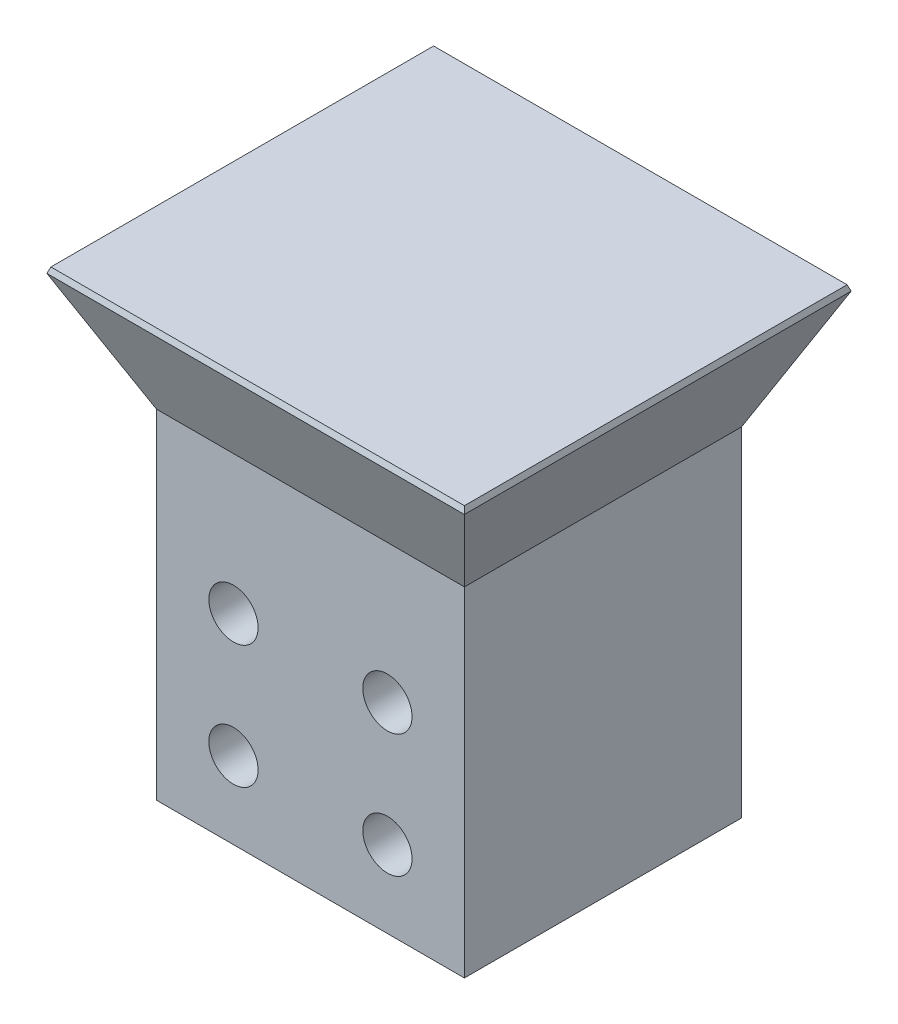
ISO-10303-21;
HEADER;
FILE_DESCRIPTION(('STEP AP214'),'2;1');
FILE_NAME('part.step','',(''),(''),'','','');
FILE_SCHEMA(('AUTOMOTIVE_DESIGN { 1 0 10303 214 1 1 1 1 }'));
ENDSEC;
DATA;
#1=APPLICATION_CONTEXT('core data for automotive mechanical design processes');
#2=APPLICATION_PROTOCOL_DEFINITION('international standard','automotive_design',2000,#1);
#3=PRODUCT_CONTEXT('',#1,'mechanical');
#4=PRODUCT('Part','Part','',(#3));
#5=PRODUCT_RELATED_PRODUCT_CATEGORY('part','',(#4));
#6=PRODUCT_DEFINITION_FORMATION('','',#4);
#7=PRODUCT_DEFINITION_CONTEXT('part definition',#1,'design');
#8=PRODUCT_DEFINITION('design','',#6,#7);
#9=PRODUCT_DEFINITION_SHAPE('','',#8);
#10=(LENGTH_UNIT() NAMED_UNIT(*) SI_UNIT(.MILLI.,.METRE.));
#11=(NAMED_UNIT(*) PLANE_ANGLE_UNIT() SI_UNIT($,.RADIAN.));
#12=(NAMED_UNIT(*) SI_UNIT($,.STERADIAN.) SOLID_ANGLE_UNIT());
#13=UNCERTAINTY_MEASURE_WITH_UNIT(LENGTH_MEASURE(1.E-05),#10,'distance_accuracy_value','');
#14=(GEOMETRIC_REPRESENTATION_CONTEXT(3) GLOBAL_UNCERTAINTY_ASSIGNED_CONTEXT((#13)) GLOBAL_UNIT_ASSIGNED_CONTEXT((#10,
#11,#12)) REPRESENTATION_CONTEXT('',''));
#15=CARTESIAN_POINT('',(0.,0.,0.));
#16=DIRECTION('',(0.,0.,1.));
#17=DIRECTION('',(1.,0.,0.));
#18=AXIS2_PLACEMENT_3D('',#15,#16,#17);
#19=CARTESIAN_POINT('',(10.,22.,9.));
#20=DIRECTION('',(-1.,0.,0.));
#21=DIRECTION('',(0.,0.,1.));
#22=AXIS2_PLACEMENT_3D('',#19,#20,#21);
#23=PLANE('',#22);
#24=DIRECTION('',(0.,0.,-1.));
#25=VECTOR('',#24,1.);
#26=CARTESIAN_POINT('',(10.,0.,9.));
#27=LINE('',#26,#25);
#28=CARTESIAN_POINT('',(10.,0.,9.));
#29=VERTEX_POINT('',#28);
#30=CARTESIAN_POINT('',(10.,0.,-9.));
#31=VERTEX_POINT('',#30);
#32=EDGE_CURVE('E106',#29,#31,#27,.T.);
#33=ORIENTED_EDGE('',*,*,#32,.T.);
#34=DIRECTION('',(0.,-1.,0.));
#35=VECTOR('',#34,1.);
#36=CARTESIAN_POINT('',(10.,22.,-9.));
#37=LINE('',#36,#35);
#38=CARTESIAN_POINT('',(10.,22.,-9.));
#39=VERTEX_POINT('',#38);
#40=EDGE_CURVE('E117',#39,#31,#37,.T.);
#41=ORIENTED_EDGE('',*,*,#40,.F.);
#42=DIRECTION('',(0.,0.,-1.));
#43=VECTOR('',#42,1.);
#44=CARTESIAN_POINT('',(10.,22.,9.));
#45=LINE('',#44,#43);
#46=CARTESIAN_POINT('',(10.,22.,9.));
#47=VERTEX_POINT('',#46);
#48=EDGE_CURVE('E102',#47,#39,#45,.T.);
#49=ORIENTED_EDGE('',*,*,#48,.F.);
#50=DIRECTION('',(0.,-1.,0.));
#51=VECTOR('',#50,1.);
#52=CARTESIAN_POINT('',(10.,22.,9.));
#53=LINE('',#52,#51);
#54=EDGE_CURVE('E114',#47,#29,#53,.T.);
#55=ORIENTED_EDGE('',*,*,#54,.T.);
#56=EDGE_LOOP('',(#33,#41,#49,#55));
#57=FACE_BOUND('',#56,.T.);
#58=ADVANCED_FACE('F34',(#57),#23,.F.);
#59=CARTESIAN_POINT('',(-10.,22.,-9.));
#60=DIRECTION('',(0.,0.,1.));
#61=DIRECTION('',(1.,0.,0.));
#62=AXIS2_PLACEMENT_3D('',#59,#60,#61);
#63=PLANE('',#62);
#64=CARTESIAN_POINT('',(5.,13.,-9.));
#65=DIRECTION('',(0.,0.,1.));
#66=DIRECTION('',(1.,0.,0.));
#67=AXIS2_PLACEMENT_3D('',#64,#65,#66);
#68=CIRCLE('',#67,1.6);
#69=CARTESIAN_POINT('',(6.6,13.,-9.));
#70=VERTEX_POINT('',#69);
#71=EDGE_CURVE('E200',#70,#70,#68,.T.);
#72=ORIENTED_EDGE('',*,*,#71,.T.);
#73=EDGE_LOOP('',(#72));
#74=FACE_BOUND('',#73,.T.);
#75=CARTESIAN_POINT('',(-5.,5.,-9.));
#76=DIRECTION('',(0.,0.,1.));
#77=DIRECTION('',(1.,0.,0.));
#78=AXIS2_PLACEMENT_3D('',#75,#76,#77);
#79=CIRCLE('',#78,1.6);
#80=CARTESIAN_POINT('',(-3.4,5.,-9.));
#81=VERTEX_POINT('',#80);
#82=EDGE_CURVE('E197',#81,#81,#79,.T.);
#83=ORIENTED_EDGE('',*,*,#82,.T.);
#84=EDGE_LOOP('',(#83));
#85=FACE_BOUND('',#84,.T.);
#86=CARTESIAN_POINT('',(5.,5.,-9.));
#87=DIRECTION('',(0.,0.,1.));
#88=DIRECTION('',(1.,0.,0.));
#89=AXIS2_PLACEMENT_3D('',#86,#87,#88);
#90=CIRCLE('',#89,1.6);
#91=CARTESIAN_POINT('',(6.6,5.,-9.));
#92=VERTEX_POINT('',#91);
#93=EDGE_CURVE('E194',#92,#92,#90,.T.);
#94=ORIENTED_EDGE('',*,*,#93,.T.);
#95=EDGE_LOOP('',(#94));
#96=FACE_BOUND('',#95,.T.);
#97=CARTESIAN_POINT('',(-5.,13.,-9.));
#98=DIRECTION('',(0.,0.,1.));
#99=DIRECTION('',(1.,0.,0.));
#100=AXIS2_PLACEMENT_3D('',#97,#98,#99);
#101=CIRCLE('',#100,1.6);
#102=CARTESIAN_POINT('',(-3.4,13.,-9.));
#103=VERTEX_POINT('',#102);
#104=EDGE_CURVE('E191',#103,#103,#101,.T.);
#105=ORIENTED_EDGE('',*,*,#104,.T.);
#106=EDGE_LOOP('',(#105));
#107=FACE_BOUND('',#106,.T.);
#108=DIRECTION('',(-1.,0.,0.));
#109=VECTOR('',#108,1.);
#110=CARTESIAN_POINT('',(-10.,0.,-9.));
#111=LINE('',#110,#109);
#112=CARTESIAN_POINT('',(-10.,0.,-9.));
#113=VERTEX_POINT('',#112);
#114=EDGE_CURVE('E140',#31,#113,#111,.T.);
#115=ORIENTED_EDGE('',*,*,#114,.T.);
#116=DIRECTION('',(0.,-1.,0.));
#117=VECTOR('',#116,1.);
#118=CARTESIAN_POINT('',(-10.,22.,-9.));
#119=LINE('',#118,#117);
#120=CARTESIAN_POINT('',(-10.,22.,-9.));
#121=VERTEX_POINT('',#120);
#122=EDGE_CURVE('E146',#121,#113,#119,.T.);
#123=ORIENTED_EDGE('',*,*,#122,.F.);
#124=DIRECTION('',(-1.,0.,0.));
#125=VECTOR('',#124,1.);
#126=CARTESIAN_POINT('',(-10.,22.,-9.));
#127=LINE('',#126,#125);
#128=EDGE_CURVE('E118',#39,#121,#127,.T.);
#129=ORIENTED_EDGE('',*,*,#128,.F.);
#130=ORIENTED_EDGE('',*,*,#40,.T.);
#131=EDGE_LOOP('',(#115,#123,#129,#130));
#132=FACE_BOUND('',#131,.T.);
#133=ADVANCED_FACE('F211',(#74,#85,#96,#107,#132),#63,.F.);
#134=CARTESIAN_POINT('',(-10.,22.,9.));
#135=DIRECTION('',(1.,0.,0.));
#136=DIRECTION('',(0.,0.,-1.));
#137=AXIS2_PLACEMENT_3D('',#134,#135,#136);
#138=PLANE('',#137);
#139=DIRECTION('',(0.,0.,1.));
#140=VECTOR('',#139,1.);
#141=CARTESIAN_POINT('',(-10.,0.,9.));
#142=LINE('',#141,#140);
#143=CARTESIAN_POINT('',(-10.,0.,9.));
#144=VERTEX_POINT('',#143);
#145=EDGE_CURVE('E142',#113,#144,#142,.T.);
#146=ORIENTED_EDGE('',*,*,#145,.T.);
#147=DIRECTION('',(0.,-1.,0.));
#148=VECTOR('',#147,1.);
#149=CARTESIAN_POINT('',(-10.,22.,9.));
#150=LINE('',#149,#148);
#151=CARTESIAN_POINT('',(-10.,22.,9.));
#152=VERTEX_POINT('',#151);
#153=EDGE_CURVE('E128',#152,#144,#150,.T.);
#154=ORIENTED_EDGE('',*,*,#153,.F.);
#155=DIRECTION('',(0.,0.,1.));
#156=VECTOR('',#155,1.);
#157=CARTESIAN_POINT('',(-10.,22.,9.));
#158=LINE('',#157,#156);
#159=EDGE_CURVE('E134',#121,#152,#158,.T.);
#160=ORIENTED_EDGE('',*,*,#159,.F.);
#161=ORIENTED_EDGE('',*,*,#122,.T.);
#162=EDGE_LOOP('',(#146,#154,#160,#161));
#163=FACE_BOUND('',#162,.T.);
#164=ADVANCED_FACE('F215',(#163),#138,.F.);
#165=CARTESIAN_POINT('',(-10.,22.,9.));
#166=DIRECTION('',(0.,0.,-1.));
#167=DIRECTION('',(-1.,0.,0.));
#168=AXIS2_PLACEMENT_3D('',#165,#166,#167);
#169=PLANE('',#168);
#170=CARTESIAN_POINT('',(5.,13.,9.));
#171=DIRECTION('',(0.,0.,1.));
#172=DIRECTION('',(1.,0.,0.));
#173=AXIS2_PLACEMENT_3D('',#170,#171,#172);
#174=CIRCLE('',#173,1.6);
#175=CARTESIAN_POINT('',(6.6,13.,9.));
#176=VERTEX_POINT('',#175);
#177=EDGE_CURVE('E183',#176,#176,#174,.T.);
#178=ORIENTED_EDGE('',*,*,#177,.F.);
#179=EDGE_LOOP('',(#178));
#180=FACE_BOUND('',#179,.T.);
#181=CARTESIAN_POINT('',(-5.,5.,9.));
#182=DIRECTION('',(0.,0.,1.));
#183=DIRECTION('',(1.,0.,0.));
#184=AXIS2_PLACEMENT_3D('',#181,#182,#183);
#185=CIRCLE('',#184,1.6);
#186=CARTESIAN_POINT('',(-3.4,5.,9.));
#187=VERTEX_POINT('',#186);
#188=EDGE_CURVE('E178',#187,#187,#185,.T.);
#189=ORIENTED_EDGE('',*,*,#188,.F.);
#190=EDGE_LOOP('',(#189));
#191=FACE_BOUND('',#190,.T.);
#192=CARTESIAN_POINT('',(5.,5.,9.));
#193=DIRECTION('',(0.,0.,1.));
#194=DIRECTION('',(1.,0.,0.));
#195=AXIS2_PLACEMENT_3D('',#192,#193,#194);
#196=CIRCLE('',#195,1.6);
#197=CARTESIAN_POINT('',(6.6,5.,9.));
#198=VERTEX_POINT('',#197);
#199=EDGE_CURVE('E173',#198,#198,#196,.T.);
#200=ORIENTED_EDGE('',*,*,#199,.F.);
#201=EDGE_LOOP('',(#200));
#202=FACE_BOUND('',#201,.T.);
#203=CARTESIAN_POINT('',(-5.,13.,9.));
#204=DIRECTION('',(0.,0.,1.));
#205=DIRECTION('',(1.,0.,0.));
#206=AXIS2_PLACEMENT_3D('',#203,#204,#205);
#207=CIRCLE('',#206,1.6);
#208=CARTESIAN_POINT('',(-3.4,13.,9.));
#209=VERTEX_POINT('',#208);
#210=EDGE_CURVE('E187',#209,#209,#207,.T.);
#211=ORIENTED_EDGE('',*,*,#210,.F.);
#212=EDGE_LOOP('',(#211));
#213=FACE_BOUND('',#212,.T.);
#214=DIRECTION('',(1.,0.,0.));
#215=VECTOR('',#214,1.);
#216=CARTESIAN_POINT('',(-10.,0.,9.));
#217=LINE('',#216,#215);
#218=EDGE_CURVE('E119',#144,#29,#217,.T.);
#219=ORIENTED_EDGE('',*,*,#218,.T.);
#220=ORIENTED_EDGE('',*,*,#54,.F.);
#221=DIRECTION('',(1.,0.,0.));
#222=VECTOR('',#221,1.);
#223=CARTESIAN_POINT('',(-10.,22.,9.));
#224=LINE('',#223,#222);
#225=EDGE_CURVE('E125',#152,#47,#224,.T.);
#226=ORIENTED_EDGE('',*,*,#225,.F.);
#227=ORIENTED_EDGE('',*,*,#153,.T.);
#228=EDGE_LOOP('',(#219,#220,#226,#227));
#229=FACE_BOUND('',#228,.T.);
#230=ADVANCED_FACE('F123',(#180,#191,#202,#213,#229),#169,.F.);
#231=CARTESIAN_POINT('',(0.,0.,0.));
#232=DIRECTION('',(0.,-1.,0.));
#233=DIRECTION('',(0.,0.,-1.));
#234=AXIS2_PLACEMENT_3D('',#231,#232,#233);
#235=PLANE('',#234);
#236=ORIENTED_EDGE('',*,*,#32,.F.);
#237=ORIENTED_EDGE('',*,*,#218,.F.);
#238=ORIENTED_EDGE('',*,*,#145,.F.);
#239=ORIENTED_EDGE('',*,*,#114,.F.);
#240=EDGE_LOOP('',(#236,#237,#238,#239));
#241=FACE_BOUND('',#240,.T.);
#242=ADVANCED_FACE('F320',(#241),#235,.T.);
#243=CARTESIAN_POINT('',(-10.,22.,9.));
#244=DIRECTION('',(0.,-0.4226182617407,0.90630778703665));
#245=DIRECTION('',(0.,-0.90630778703665,-0.4226182617407));
#246=AXIS2_PLACEMENT_3D('',#243,#244,#245);
#247=PLANE('',#246);
#248=DIRECTION('',(-0.389281620635026,-0.834817129478987,-0.389281620635026));
#249=VECTOR('',#248,1.);
#250=CARTESIAN_POINT('',(10.,22.,9.));
#251=LINE('',#250,#249);
#252=CARTESIAN_POINT('',(13.5614139605437,29.6374768851853,12.5614139605437));
#253=VERTEX_POINT('',#252);
#254=EDGE_CURVE('E99',#253,#47,#251,.T.);
#255=ORIENTED_EDGE('',*,*,#254,.F.);
#256=DIRECTION('',(1.,0.,0.));
#257=VECTOR('',#256,1.);
#258=CARTESIAN_POINT('',(-13.73046126524,29.6374768851853,12.5614139605437));
#259=LINE('',#258,#257);
#260=CARTESIAN_POINT('',(-13.5614139605437,29.6374768851853,12.5614139605437));
#261=VERTEX_POINT('',#260);
#262=EDGE_CURVE('E11',#253,#261,#259,.F.);
#263=ORIENTED_EDGE('',*,*,#262,.T.);
#264=DIRECTION('',(0.389281620635026,-0.834817129478987,-0.389281620635026));
#265=VECTOR('',#264,1.);
#266=CARTESIAN_POINT('',(-10.,22.,9.));
#267=LINE('',#266,#265);
#268=EDGE_CURVE('E132',#261,#152,#267,.T.);
#269=ORIENTED_EDGE('',*,*,#268,.T.);
#270=ORIENTED_EDGE('',*,*,#225,.T.);
#271=EDGE_LOOP('',(#255,#263,#269,#270));
#272=FACE_BOUND('',#271,.T.);
#273=ADVANCED_FACE('F130',(#272),#247,.T.);
#274=CARTESIAN_POINT('',(10.,22.,9.));
#275=DIRECTION('',(0.90630778703665,-0.4226182617407,0.));
#276=DIRECTION('',(0.4226182617407,0.90630778703665,0.));
#277=AXIS2_PLACEMENT_3D('',#274,#275,#276);
#278=PLANE('',#277);
#279=DIRECTION('',(-0.389281620635026,-0.834817129478987,0.389281620635026));
#280=VECTOR('',#279,1.);
#281=CARTESIAN_POINT('',(10.,22.,-9.));
#282=LINE('',#281,#280);
#283=CARTESIAN_POINT('',(13.5614139605437,29.6374768851853,-12.5614139605437));
#284=VERTEX_POINT('',#283);
#285=EDGE_CURVE('E107',#284,#39,#282,.T.);
#286=ORIENTED_EDGE('',*,*,#285,.F.);
#287=DIRECTION('',(0.,0.,-1.));
#288=VECTOR('',#287,1.);
#289=CARTESIAN_POINT('',(13.5614139605437,29.6374768851853,12.73046126524));
#290=LINE('',#289,#288);
#291=EDGE_CURVE('E44',#284,#253,#290,.F.);
#292=ORIENTED_EDGE('',*,*,#291,.T.);
#293=ORIENTED_EDGE('',*,*,#254,.T.);
#294=ORIENTED_EDGE('',*,*,#48,.T.);
#295=EDGE_LOOP('',(#286,#292,#293,#294));
#296=FACE_BOUND('',#295,.T.);
#297=ADVANCED_FACE('F101',(#296),#278,.T.);
#298=CARTESIAN_POINT('',(10.,22.,-9.));
#299=DIRECTION('',(0.,-0.4226182617407,-0.90630778703665));
#300=DIRECTION('',(0.,0.90630778703665,-0.4226182617407));
#301=AXIS2_PLACEMENT_3D('',#298,#299,#300);
#302=PLANE('',#301);
#303=DIRECTION('',(0.389281620635026,-0.834817129478987,0.389281620635026));
#304=VECTOR('',#303,1.);
#305=CARTESIAN_POINT('',(-10.,22.,-9.));
#306=LINE('',#305,#304);
#307=CARTESIAN_POINT('',(-13.5614139605437,29.6374768851853,-12.5614139605437));
#308=VERTEX_POINT('',#307);
#309=EDGE_CURVE('E204',#308,#121,#306,.T.);
#310=ORIENTED_EDGE('',*,*,#309,.F.);
#311=DIRECTION('',(-1.,0.,0.));
#312=VECTOR('',#311,1.);
#313=CARTESIAN_POINT('',(13.73046126524,29.6374768851853,-12.5614139605437));
#314=LINE('',#313,#312);
#315=EDGE_CURVE('E59',#308,#284,#314,.F.);
#316=ORIENTED_EDGE('',*,*,#315,.T.);
#317=ORIENTED_EDGE('',*,*,#285,.T.);
#318=ORIENTED_EDGE('',*,*,#128,.T.);
#319=EDGE_LOOP('',(#310,#316,#317,#318));
#320=FACE_BOUND('',#319,.T.);
#321=ADVANCED_FACE('F208',(#320),#302,.T.);
#322=CARTESIAN_POINT('',(-10.,22.,-9.));
#323=DIRECTION('',(-0.90630778703665,-0.4226182617407,0.));
#324=DIRECTION('',(0.4226182617407,-0.90630778703665,0.));
#325=AXIS2_PLACEMENT_3D('',#322,#323,#324);
#326=PLANE('',#325);
#327=ORIENTED_EDGE('',*,*,#268,.F.);
#328=DIRECTION('',(0.,0.,1.));
#329=VECTOR('',#328,1.);
#330=CARTESIAN_POINT('',(-13.5614139605437,29.6374768851853,-12.73046126524));
#331=LINE('',#330,#329);
#332=EDGE_CURVE('E159',#261,#308,#331,.F.);
#333=ORIENTED_EDGE('',*,*,#332,.T.);
#334=ORIENTED_EDGE('',*,*,#309,.T.);
#335=ORIENTED_EDGE('',*,*,#159,.T.);
#336=EDGE_LOOP('',(#327,#333,#334,#335));
#337=FACE_BOUND('',#336,.T.);
#338=ADVANCED_FACE('F217',(#337),#326,.T.);
#339=CARTESIAN_POINT('',(0.,30.,0.));
#340=DIRECTION('',(0.,1.,0.));
#341=DIRECTION('',(0.,0.,1.));
#342=AXIS2_PLACEMENT_3D('',#339,#340,#341);
#343=PLANE('',#342);
#344=DIRECTION('',(-1.,0.,0.));
#345=VECTOR('',#344,1.);
#346=CARTESIAN_POINT('',(-13.73046126524,30.,-12.4294663375177));
#347=LINE('',#346,#345);
#348=CARTESIAN_POINT('',(13.4294663375177,30.,-12.4294663375177));
#349=VERTEX_POINT('',#348);
#350=CARTESIAN_POINT('',(-13.4294663375177,30.,-12.4294663375177));
#351=VERTEX_POINT('',#350);
#352=EDGE_CURVE('E154',#349,#351,#347,.T.);
#353=ORIENTED_EDGE('',*,*,#352,.T.);
#354=DIRECTION('',(0.,0.,1.));
#355=VECTOR('',#354,1.);
#356=CARTESIAN_POINT('',(-13.4294663375177,30.,12.73046126524));
#357=LINE('',#356,#355);
#358=CARTESIAN_POINT('',(-13.4294663375177,30.,12.4294663375177));
#359=VERTEX_POINT('',#358);
#360=EDGE_CURVE('E156',#351,#359,#357,.T.);
#361=ORIENTED_EDGE('',*,*,#360,.T.);
#362=DIRECTION('',(1.,0.,0.));
#363=VECTOR('',#362,1.);
#364=CARTESIAN_POINT('',(13.73046126524,30.,12.4294663375177));
#365=LINE('',#364,#363);
#366=CARTESIAN_POINT('',(13.4294663375177,30.,12.4294663375177));
#367=VERTEX_POINT('',#366);
#368=EDGE_CURVE('E150',#359,#367,#365,.T.);
#369=ORIENTED_EDGE('',*,*,#368,.T.);
#370=DIRECTION('',(0.,0.,-1.));
#371=VECTOR('',#370,1.);
#372=CARTESIAN_POINT('',(13.4294663375177,30.,-12.73046126524));
#373=LINE('',#372,#371);
#374=EDGE_CURVE('E152',#367,#349,#373,.T.);
#375=ORIENTED_EDGE('',*,*,#374,.T.);
#376=EDGE_LOOP('',(#353,#361,#369,#375));
#377=FACE_BOUND('',#376,.T.);
#378=ADVANCED_FACE('F227',(#377),#343,.T.);
#379=CARTESIAN_POINT('',(-5.,13.,-12.73046126524));
#380=DIRECTION('',(0.,0.,1.));
#381=DIRECTION('',(1.,0.,0.));
#382=AXIS2_PLACEMENT_3D('',#379,#380,#381);
#383=CYLINDRICAL_SURFACE('',#382,1.6);
#384=ORIENTED_EDGE('',*,*,#210,.T.);
#385=EDGE_LOOP('',(#384));
#386=FACE_BOUND('',#385,.T.);
#387=ORIENTED_EDGE('',*,*,#104,.F.);
#388=EDGE_LOOP('',(#387));
#389=FACE_BOUND('',#388,.T.);
#390=ADVANCED_FACE('F285',(#386,#389),#383,.F.);
#391=CARTESIAN_POINT('',(5.,5.,-12.73046126524));
#392=DIRECTION('',(0.,0.,1.));
#393=DIRECTION('',(1.,0.,0.));
#394=AXIS2_PLACEMENT_3D('',#391,#392,#393);
#395=CYLINDRICAL_SURFACE('',#394,1.6);
#396=ORIENTED_EDGE('',*,*,#199,.T.);
#397=EDGE_LOOP('',(#396));
#398=FACE_BOUND('',#397,.T.);
#399=ORIENTED_EDGE('',*,*,#93,.F.);
#400=EDGE_LOOP('',(#399));
#401=FACE_BOUND('',#400,.T.);
#402=ADVANCED_FACE('F339',(#398,#401),#395,.F.);
#403=CARTESIAN_POINT('',(-5.,5.,-12.73046126524));
#404=DIRECTION('',(0.,0.,1.));
#405=DIRECTION('',(1.,0.,0.));
#406=AXIS2_PLACEMENT_3D('',#403,#404,#405);
#407=CYLINDRICAL_SURFACE('',#406,1.6);
#408=ORIENTED_EDGE('',*,*,#188,.T.);
#409=EDGE_LOOP('',(#408));
#410=FACE_BOUND('',#409,.T.);
#411=ORIENTED_EDGE('',*,*,#82,.F.);
#412=EDGE_LOOP('',(#411));
#413=FACE_BOUND('',#412,.T.);
#414=ADVANCED_FACE('F329',(#410,#413),#407,.F.);
#415=CARTESIAN_POINT('',(5.,13.,-12.73046126524));
#416=DIRECTION('',(0.,0.,1.));
#417=DIRECTION('',(1.,0.,0.));
#418=AXIS2_PLACEMENT_3D('',#415,#416,#417);
#419=CYLINDRICAL_SURFACE('',#418,1.6);
#420=ORIENTED_EDGE('',*,*,#177,.T.);
#421=EDGE_LOOP('',(#420));
#422=FACE_BOUND('',#421,.T.);
#423=ORIENTED_EDGE('',*,*,#71,.F.);
#424=EDGE_LOOP('',(#423));
#425=FACE_BOUND('',#424,.T.);
#426=ADVANCED_FACE('F235',(#422,#425),#419,.F.);
#427=CARTESIAN_POINT('',(13.4294663375177,30.,0.));
#428=DIRECTION('',(-0.939692620785911,-0.342020143325662,0.));
#429=DIRECTION('',(0.,0.,-1.));
#430=AXIS2_PLACEMENT_3D('',#427,#428,#429);
#431=PLANE('',#430);
#432=DIRECTION('',(-0.323615577118178,0.889126490715991,-0.323615577118183));
#433=VECTOR('',#432,1.);
#434=CARTESIAN_POINT('',(12.0230380556608,33.8641299464842,11.0230380556608));
#435=LINE('',#434,#433);
#436=EDGE_CURVE('E167',#253,#367,#435,.T.);
#437=ORIENTED_EDGE('',*,*,#436,.F.);
#438=ORIENTED_EDGE('',*,*,#291,.F.);
#439=DIRECTION('',(-0.323615577118178,0.889126490715991,0.323615577118183));
#440=VECTOR('',#439,1.);
#441=CARTESIAN_POINT('',(12.1277650974144,33.5763947640601,-11.1277650974143));
#442=LINE('',#441,#440);
#443=EDGE_CURVE('E39',#349,#284,#442,.F.);
#444=ORIENTED_EDGE('',*,*,#443,.F.);
#445=ORIENTED_EDGE('',*,*,#374,.F.);
#446=EDGE_LOOP('',(#437,#438,#444,#445));
#447=FACE_BOUND('',#446,.T.);
#448=ADVANCED_FACE('F37',(#447),#431,.F.);
#449=CARTESIAN_POINT('',(0.,30.,-12.4294663375177));
#450=DIRECTION('',(0.,-0.342020143325666,0.939692620785909));
#451=DIRECTION('',(-1.,0.,0.));
#452=AXIS2_PLACEMENT_3D('',#449,#450,#451);
#453=PLANE('',#452);
#454=ORIENTED_EDGE('',*,*,#443,.T.);
#455=ORIENTED_EDGE('',*,*,#315,.F.);
#456=DIRECTION('',(0.323615577118178,0.889126490715991,0.323615577118183));
#457=VECTOR('',#456,1.);
#458=CARTESIAN_POINT('',(-12.0230380556608,33.8641299464842,-11.0230380556608));
#459=LINE('',#458,#457);
#460=EDGE_CURVE('E166',#351,#308,#459,.F.);
#461=ORIENTED_EDGE('',*,*,#460,.F.);
#462=ORIENTED_EDGE('',*,*,#352,.F.);
#463=EDGE_LOOP('',(#454,#455,#461,#462));
#464=FACE_BOUND('',#463,.T.);
#465=ADVANCED_FACE('F228',(#464),#453,.F.);
#466=CARTESIAN_POINT('',(0.,30.,12.4294663375177));
#467=DIRECTION('',(0.,-0.342020143325666,-0.939692620785909));
#468=DIRECTION('',(1.,0.,0.));
#469=AXIS2_PLACEMENT_3D('',#466,#467,#468);
#470=PLANE('',#469);
#471=ORIENTED_EDGE('',*,*,#436,.T.);
#472=ORIENTED_EDGE('',*,*,#368,.F.);
#473=DIRECTION('',(-0.323615577118178,-0.889126490715991,0.323615577118183));
#474=VECTOR('',#473,1.);
#475=CARTESIAN_POINT('',(-12.0230380556608,33.8641299464842,11.0230380556608));
#476=LINE('',#475,#474);
#477=EDGE_CURVE('E164',#261,#359,#476,.F.);
#478=ORIENTED_EDGE('',*,*,#477,.F.);
#479=ORIENTED_EDGE('',*,*,#262,.F.);
#480=EDGE_LOOP('',(#471,#472,#478,#479));
#481=FACE_BOUND('',#480,.T.);
#482=ADVANCED_FACE('F224',(#481),#470,.F.);
#483=CARTESIAN_POINT('',(-13.4294663375177,30.,0.));
#484=DIRECTION('',(0.939692620785911,-0.342020143325662,0.));
#485=DIRECTION('',(0.,0.,1.));
#486=AXIS2_PLACEMENT_3D('',#483,#484,#485);
#487=PLANE('',#486);
#488=ORIENTED_EDGE('',*,*,#460,.T.);
#489=ORIENTED_EDGE('',*,*,#332,.F.);
#490=ORIENTED_EDGE('',*,*,#477,.T.);
#491=ORIENTED_EDGE('',*,*,#360,.F.);
#492=EDGE_LOOP('',(#488,#489,#490,#491));
#493=FACE_BOUND('',#492,.T.);
#494=ADVANCED_FACE('F221',(#493),#487,.F.);
#495=CLOSED_SHELL('',(#58,#133,#164,#230,#242,#273,#297,#321,#338,#378,#390,#402,#414,#426,#448,
#465,#482,#494));
#496=MANIFOLD_SOLID_BREP('B2',#495);
#497=ADVANCED_BREP_SHAPE_REPRESENTATION('',(#18,#496),#14);
#498=SHAPE_DEFINITION_REPRESENTATION(#9,#497);
ENDSEC;
END-ISO-10303-21;
